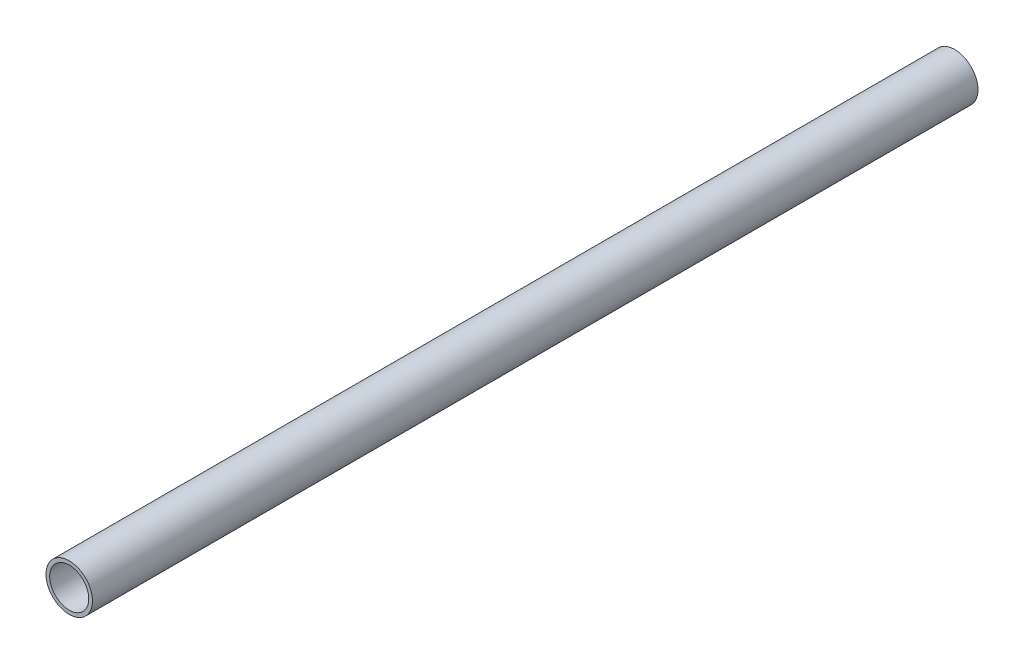
ISO-10303-21;
HEADER;
FILE_DESCRIPTION(('STEP AP214'),'2;1');
FILE_NAME('part.step','',(''),(''),'','','');
FILE_SCHEMA(('AUTOMOTIVE_DESIGN { 1 0 10303 214 1 1 1 1 }'));
ENDSEC;
DATA;
#1=APPLICATION_CONTEXT('core data for automotive mechanical design processes');
#2=APPLICATION_PROTOCOL_DEFINITION('international standard','automotive_design',2000,#1);
#3=PRODUCT_CONTEXT('',#1,'mechanical');
#4=PRODUCT('Part','Part','',(#3));
#5=PRODUCT_RELATED_PRODUCT_CATEGORY('part','',(#4));
#6=PRODUCT_DEFINITION_FORMATION('','',#4);
#7=PRODUCT_DEFINITION_CONTEXT('part definition',#1,'design');
#8=PRODUCT_DEFINITION('design','',#6,#7);
#9=PRODUCT_DEFINITION_SHAPE('','',#8);
#10=(LENGTH_UNIT() NAMED_UNIT(*) SI_UNIT(.MILLI.,.METRE.));
#11=(NAMED_UNIT(*) PLANE_ANGLE_UNIT() SI_UNIT($,.RADIAN.));
#12=(NAMED_UNIT(*) SI_UNIT($,.STERADIAN.) SOLID_ANGLE_UNIT());
#13=UNCERTAINTY_MEASURE_WITH_UNIT(LENGTH_MEASURE(1.E-05),#10,'distance_accuracy_value','');
#14=(GEOMETRIC_REPRESENTATION_CONTEXT(3) GLOBAL_UNCERTAINTY_ASSIGNED_CONTEXT((#13)) GLOBAL_UNIT_ASSIGNED_CONTEXT((#10,
#11,#12)) REPRESENTATION_CONTEXT('',''));
#15=CARTESIAN_POINT('',(0.,0.,0.));
#16=DIRECTION('',(0.,0.,1.));
#17=DIRECTION('',(1.,0.,0.));
#18=AXIS2_PLACEMENT_3D('',#15,#16,#17);
#19=CARTESIAN_POINT('',(0.,0.,476.));
#20=DIRECTION('',(0.,0.,1.));
#21=DIRECTION('',(1.,0.,0.));
#22=AXIS2_PLACEMENT_3D('',#19,#20,#21);
#23=PLANE('',#22);
#24=CARTESIAN_POINT('',(0.,0.,476.));
#25=DIRECTION('',(0.,0.,1.));
#26=DIRECTION('',(1.,0.,0.));
#27=AXIS2_PLACEMENT_3D('',#24,#25,#26);
#28=CIRCLE('',#27,12.5);
#29=CARTESIAN_POINT('',(12.5,0.,476.));
#30=VERTEX_POINT('',#29);
#31=EDGE_CURVE('E10',#30,#30,#28,.T.);
#32=ORIENTED_EDGE('',*,*,#31,.T.);
#33=EDGE_LOOP('',(#32));
#34=FACE_BOUND('',#33,.T.);
#35=CARTESIAN_POINT('',(0.,0.,476.));
#36=DIRECTION('',(0.,0.,1.));
#37=DIRECTION('',(1.,0.,0.));
#38=AXIS2_PLACEMENT_3D('',#35,#36,#37);
#39=CIRCLE('',#38,10.5);
#40=CARTESIAN_POINT('',(10.5,0.,476.));
#41=VERTEX_POINT('',#40);
#42=EDGE_CURVE('E42',#41,#41,#39,.T.);
#43=ORIENTED_EDGE('',*,*,#42,.F.);
#44=EDGE_LOOP('',(#43));
#45=FACE_BOUND('',#44,.T.);
#46=ADVANCED_FACE('F31',(#34,#45),#23,.T.);
#47=CARTESIAN_POINT('',(0.,0.,0.));
#48=DIRECTION('',(0.,0.,1.));
#49=DIRECTION('',(1.,0.,0.));
#50=AXIS2_PLACEMENT_3D('',#47,#48,#49);
#51=PLANE('',#50);
#52=CARTESIAN_POINT('',(0.,0.,0.));
#53=DIRECTION('',(0.,0.,1.));
#54=DIRECTION('',(1.,0.,0.));
#55=AXIS2_PLACEMENT_3D('',#52,#53,#54);
#56=CIRCLE('',#55,12.5);
#57=CARTESIAN_POINT('',(12.5,0.,0.));
#58=VERTEX_POINT('',#57);
#59=EDGE_CURVE('E35',#58,#58,#56,.T.);
#60=ORIENTED_EDGE('',*,*,#59,.F.);
#61=EDGE_LOOP('',(#60));
#62=FACE_BOUND('',#61,.T.);
#63=CARTESIAN_POINT('',(0.,0.,0.));
#64=DIRECTION('',(0.,0.,1.));
#65=DIRECTION('',(1.,0.,0.));
#66=AXIS2_PLACEMENT_3D('',#63,#64,#65);
#67=CIRCLE('',#66,10.5);
#68=CARTESIAN_POINT('',(10.5,0.,0.));
#69=VERTEX_POINT('',#68);
#70=EDGE_CURVE('E44',#69,#69,#67,.T.);
#71=ORIENTED_EDGE('',*,*,#70,.T.);
#72=EDGE_LOOP('',(#71));
#73=FACE_BOUND('',#72,.T.);
#74=ADVANCED_FACE('F54',(#62,#73),#51,.F.);
#75=CARTESIAN_POINT('',(0.,0.,476.));
#76=DIRECTION('',(0.,0.,-1.));
#77=DIRECTION('',(-1.,0.,0.));
#78=AXIS2_PLACEMENT_3D('',#75,#76,#77);
#79=CYLINDRICAL_SURFACE('',#78,12.5);
#80=ORIENTED_EDGE('',*,*,#31,.F.);
#81=EDGE_LOOP('',(#80));
#82=FACE_BOUND('',#81,.T.);
#83=ORIENTED_EDGE('',*,*,#59,.T.);
#84=EDGE_LOOP('',(#83));
#85=FACE_BOUND('',#84,.T.);
#86=ADVANCED_FACE('F33',(#82,#85),#79,.T.);
#87=CARTESIAN_POINT('',(0.,0.,476.));
#88=DIRECTION('',(0.,0.,-1.));
#89=DIRECTION('',(-1.,0.,0.));
#90=AXIS2_PLACEMENT_3D('',#87,#88,#89);
#91=CYLINDRICAL_SURFACE('',#90,10.5);
#92=ORIENTED_EDGE('',*,*,#42,.T.);
#93=EDGE_LOOP('',(#92));
#94=FACE_BOUND('',#93,.T.);
#95=ORIENTED_EDGE('',*,*,#70,.F.);
#96=EDGE_LOOP('',(#95));
#97=FACE_BOUND('',#96,.T.);
#98=ADVANCED_FACE('F50',(#94,#97),#91,.F.);
#99=CLOSED_SHELL('',(#46,#74,#86,#98));
#100=MANIFOLD_SOLID_BREP('B2',#99);
#101=ADVANCED_BREP_SHAPE_REPRESENTATION('',(#18,#100),#14);
#102=SHAPE_DEFINITION_REPRESENTATION(#9,#101);
ENDSEC;
END-ISO-10303-21;
